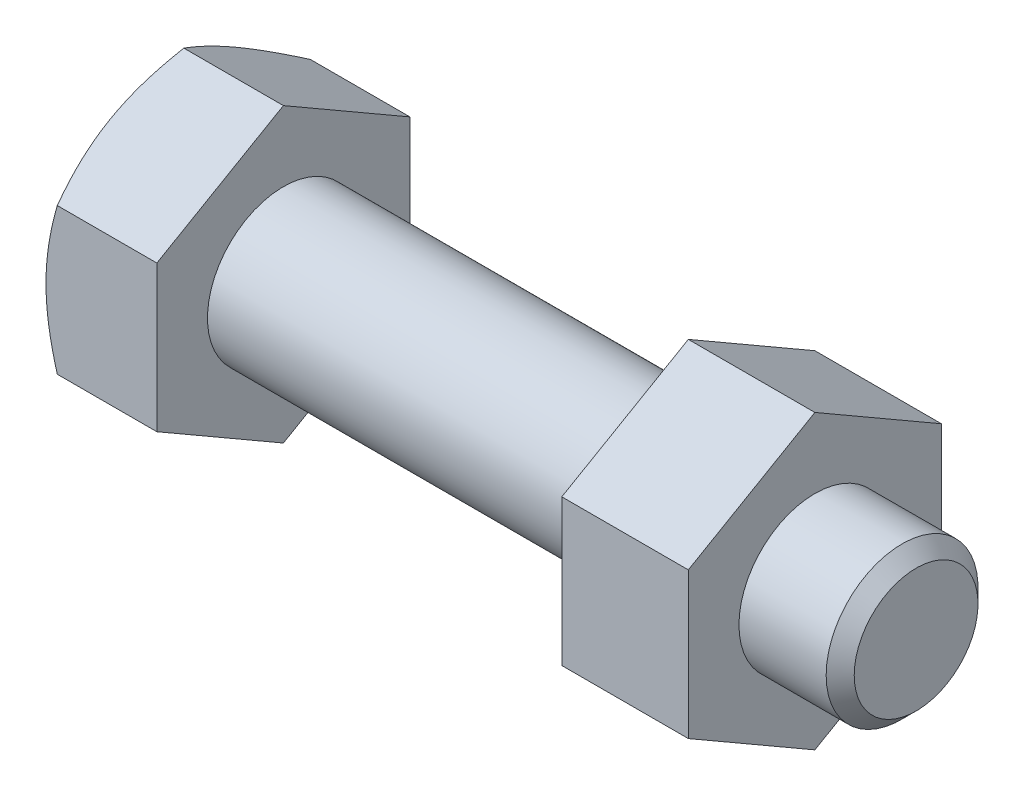
ISO-10303-21;
HEADER;
FILE_DESCRIPTION(('STEP AP214'),'2;1');
FILE_NAME('part.step','',(''),(''),'','','');
FILE_SCHEMA(('AUTOMOTIVE_DESIGN { 1 0 10303 214 1 1 1 1 }'));
ENDSEC;
DATA;
#1=APPLICATION_CONTEXT('core data for automotive mechanical design processes');
#2=APPLICATION_PROTOCOL_DEFINITION('international standard','automotive_design',2000,#1);
#3=PRODUCT_CONTEXT('',#1,'mechanical');
#4=PRODUCT('Part','Part','',(#3));
#5=PRODUCT_RELATED_PRODUCT_CATEGORY('part','',(#4));
#6=PRODUCT_DEFINITION_FORMATION('','',#4);
#7=PRODUCT_DEFINITION_CONTEXT('part definition',#1,'design');
#8=PRODUCT_DEFINITION('design','',#6,#7);
#9=PRODUCT_DEFINITION_SHAPE('','',#8);
#10=(LENGTH_UNIT() NAMED_UNIT(*) SI_UNIT(.MILLI.,.METRE.));
#11=(NAMED_UNIT(*) PLANE_ANGLE_UNIT() SI_UNIT($,.RADIAN.));
#12=(NAMED_UNIT(*) SI_UNIT($,.STERADIAN.) SOLID_ANGLE_UNIT());
#13=UNCERTAINTY_MEASURE_WITH_UNIT(LENGTH_MEASURE(1.E-05),#10,'distance_accuracy_value','');
#14=(GEOMETRIC_REPRESENTATION_CONTEXT(3) GLOBAL_UNCERTAINTY_ASSIGNED_CONTEXT((#13)) GLOBAL_UNIT_ASSIGNED_CONTEXT((#10,
#11,#12)) REPRESENTATION_CONTEXT('',''));
#15=CARTESIAN_POINT('',(0.,0.,0.));
#16=DIRECTION('',(0.,0.,1.));
#17=DIRECTION('',(1.,0.,0.));
#18=AXIS2_PLACEMENT_3D('',#15,#16,#17);
#19=CARTESIAN_POINT('',(0.,0.,0.));
#20=DIRECTION('',(-1.00000000000003,0.,0.));
#21=DIRECTION('',(0.,0.,1.00000000000003));
#22=AXIS2_PLACEMENT_3D('',#19,#20,#21);
#23=CYLINDRICAL_SURFACE('',#22,3.);
#24=CARTESIAN_POINT('',(4.37999999999961,-1.55431223447522E-12,-2.38697950294409E-12));
#25=DIRECTION('',(1.00000000000003,0.,0.));
#26=DIRECTION('',(0.,0.,-1.00000000000003));
#27=AXIS2_PLACEMENT_3D('',#24,#25,#26);
#28=CIRCLE('',#27,3.);
#29=CARTESIAN_POINT('',(4.37999999999961,-1.53932422364278E-12,-3.00000000000248));
#30=VERTEX_POINT('',#29);
#31=EDGE_CURVE('E305',#30,#30,#28,.F.);
#32=ORIENTED_EDGE('',*,*,#31,.F.);
#33=EDGE_LOOP('',(#32));
#34=FACE_BOUND('',#33,.T.);
#35=CARTESIAN_POINT('',(20.3799999999984,-1.66533453693773E-12,-5.27355936696949E-12));
#36=DIRECTION('',(1.00000000000003,0.,0.));
#37=DIRECTION('',(0.,0.,-1.00000000000003));
#38=AXIS2_PLACEMENT_3D('',#35,#36,#37);
#39=CIRCLE('',#38,3.);
#40=CARTESIAN_POINT('',(20.3799999999984,-1.6503465261053E-12,-3.00000000000537));
#41=VERTEX_POINT('',#40);
#42=EDGE_CURVE('E11',#41,#41,#39,.T.);
#43=ORIENTED_EDGE('',*,*,#42,.F.);
#44=EDGE_LOOP('',(#43));
#45=FACE_BOUND('',#44,.T.);
#46=ADVANCED_FACE('F34',(#34,#45),#23,.T.);
#47=CARTESIAN_POINT('',(4.37999999999911,2.88675134594507,-5.00000000000056));
#48=DIRECTION('',(0.,-0.866025403784492,0.50000000000002));
#49=DIRECTION('',(0.,-0.500000000000027,-0.86602540378446));
#50=AXIS2_PLACEMENT_3D('',#47,#48,#49);
#51=PLANE('',#50);
#52=CARTESIAN_POINT('',(0.44664865605093,5.7736181619501,0.000200000000671885));
#53=CARTESIAN_POINT('',(0.37338656763655,5.64675433464942,-0.219534594524097));
#54=CARTESIAN_POINT('',(0.306751321916835,5.51880543790398,-0.441148584458488));
#55=CARTESIAN_POINT('',(0.190438991009322,5.26069210252062,-0.888213995452737));
#56=CARTESIAN_POINT('',(0.140803049914237,5.13052307794464,-1.11367335959032));
#57=CARTESIAN_POINT('',(0.0635510254171793,4.87177839004364,-1.56183230522364));
#58=CARTESIAN_POINT('',(0.0354203782820658,4.74324302208091,-1.78446209310459));
#59=CARTESIAN_POINT('',(0.0101949219521058,4.54998783159793,-2.11918990184745));
#60=CARTESIAN_POINT('',(0.00461345976780419,4.48552534904795,-2.23084219680601));
#61=CARTESIAN_POINT('',(-0.000797783249745784,4.35654081066565,-2.45424997067507));
#62=CARTESIAN_POINT('',(-0.000627741742447269,4.292018756735,-2.56600544629177));
#63=CARTESIAN_POINT('',(0.00775363179195132,4.11524635304898,-2.87218423085213));
#64=CARTESIAN_POINT('',(0.0218297718964076,4.003054577688,-3.06650608596853));
#65=CARTESIAN_POINT('',(0.0664652571080783,3.77941563226123,-3.45386010199868));
#66=CARTESIAN_POINT('',(0.0970398601464054,3.66796924828095,-3.64689090137237));
#67=CARTESIAN_POINT('',(0.173468493620326,3.44387972422849,-4.03502534247528));
#68=CARTESIAN_POINT('',(0.21964637887785,3.331264865984,-4.23007999864195));
#69=CARTESIAN_POINT('',(0.32445179449087,3.10771464157672,-4.61728034535857));
#70=CARTESIAN_POINT('',(0.38305470343607,2.99677641204574,-4.80943099540768));
#71=CARTESIAN_POINT('',(0.446648656050153,2.88663587589133,-5.00019999999934));
#72=B_SPLINE_CURVE_WITH_KNOTS('',3,(#52,#53,#54,#55,#56,#57,#58,#59,#60,#61,#62,#63,#64,#65,#66,
#67,#68,#69,#70,#71),.UNSPECIFIED.,.F.,.F.,(4,2,2,2,2,2,2,2,2,4),(0.,0.792555841364099,
1.5870166005352,2.36181537487563,2.74884076077659,3.13585419177682,3.80962362600014,
4.48401723901465,5.17336882349133,5.86136694793868),.UNSPECIFIED.);
#73=CARTESIAN_POINT('',(0.446581987382566,5.77350269189636,0.));
#74=VERTEX_POINT('',#73);
#75=CARTESIAN_POINT('',(-1.60982338570648E-12,4.33012701892077,-2.49999999999928));
#76=VERTEX_POINT('',#75);
#77=EDGE_CURVE('E50',#74,#76,#72,.T.);
#78=ORIENTED_EDGE('',*,*,#77,.F.);
#79=DIRECTION('',(-1.00000000000003,0.,0.));
#80=VECTOR('',#79,1.);
#81=CARTESIAN_POINT('',(4.37999999999933,5.77350269189281,1.72084568816899E-12));
#82=LINE('',#81,#80);
#83=CARTESIAN_POINT('',(4.37999999999933,5.77350269189281,1.72084568816899E-12));
#84=VERTEX_POINT('',#83);
#85=EDGE_CURVE('E341',#84,#74,#82,.T.);
#86=ORIENTED_EDGE('',*,*,#85,.F.);
#87=DIRECTION('',(0.,0.500000000000029,0.866025403784461));
#88=VECTOR('',#87,1.);
#89=CARTESIAN_POINT('',(4.37999999999911,2.88675134594507,-5.00000000000056));
#90=LINE('',#89,#88);
#91=CARTESIAN_POINT('',(4.37999999999911,2.88675134594507,-5.00000000000056));
#92=VERTEX_POINT('',#91);
#93=EDGE_CURVE('E309',#92,#84,#90,.T.);
#94=ORIENTED_EDGE('',*,*,#93,.F.);
#95=DIRECTION('',(-1.00000000000003,0.,0.));
#96=VECTOR('',#95,1.);
#97=CARTESIAN_POINT('',(4.37999999999911,2.88675134594507,-5.00000000000056));
#98=LINE('',#97,#96);
#99=CARTESIAN_POINT('',(0.446581987384342,2.8867513459454,-5.00000000000095));
#100=VERTEX_POINT('',#99);
#101=EDGE_CURVE('E326',#92,#100,#98,.T.);
#102=ORIENTED_EDGE('',*,*,#101,.T.);
#103=EDGE_CURVE('E256',#76,#100,#72,.T.);
#104=ORIENTED_EDGE('',*,*,#103,.F.);
#105=EDGE_LOOP('',(#78,#86,#94,#102,#104));
#106=FACE_BOUND('',#105,.T.);
#107=ADVANCED_FACE('F36',(#106),#51,.F.);
#108=CARTESIAN_POINT('',(4.37999999999933,5.77350269189281,1.72084568816899E-12));
#109=DIRECTION('',(0.,-0.866025403784489,-0.500000000000013));
#110=DIRECTION('',(0.,0.500000000000032,-0.866025403784483));
#111=AXIS2_PLACEMENT_3D('',#108,#109,#110);
#112=PLANE('',#111);
#113=CARTESIAN_POINT('',(0.446648656052262,2.88663587589133,5.00020000000501));
#114=CARTESIAN_POINT('',(0.373386567637881,3.01349970318991,4.78046540547877));
#115=CARTESIAN_POINT('',(0.306751321918157,3.1414485999345,4.55885141554368));
#116=CARTESIAN_POINT('',(0.190438991010482,3.39956193531737,4.11178600454862));
#117=CARTESIAN_POINT('',(0.140803049915252,3.52973095989372,3.88632664041093));
#118=CARTESIAN_POINT('',(0.0635510254177231,3.78847564779521,3.43816769477735));
#119=CARTESIAN_POINT('',(0.0354203782822814,3.91701101575806,3.21553790689626));
#120=CARTESIAN_POINT('',(0.0101949219526077,4.11026620624094,2.88081009815303));
#121=CARTESIAN_POINT('',(0.00461345976853075,4.17472868879082,2.76915780319434));
#122=CARTESIAN_POINT('',(-0.000797783249966767,4.3037132271736,2.5457500293254));
#123=CARTESIAN_POINT('',(-0.000627741743841576,4.36823528110481,2.43399455370895));
#124=CARTESIAN_POINT('',(0.00775363178951034,4.54500768479133,2.12781576914873));
#125=CARTESIAN_POINT('',(0.0218297718957019,4.65719946015147,1.9334939140318));
#126=CARTESIAN_POINT('',(0.0664652571085981,4.88083840557772,1.5461398980011));
#127=CARTESIAN_POINT('',(0.0970398601464163,4.99228478955831,1.35310909862739));
#128=CARTESIAN_POINT('',(0.173468493619885,5.21637431361115,0.96497465752422));
#129=CARTESIAN_POINT('',(0.219646378877484,5.32898917185567,0.769920001357292));
#130=CARTESIAN_POINT('',(0.324451794490797,5.55253939626311,0.382719654640347));
#131=CARTESIAN_POINT('',(0.383054703436212,5.6634776257942,0.190569004591162));
#132=CARTESIAN_POINT('',(0.446648656050375,5.77361816194899,-0.000200000000394329));
#133=B_SPLINE_CURVE_WITH_KNOTS('',3,(#113,#114,#115,#116,#117,#118,#119,#120,#121,#122,#123,
#124,#125,#126,#127,#128,#129,#130,#131,#132),.UNSPECIFIED.,.F.,.F.,(4,2,2,2,2,2,2,2,2,4),(0.,
0.792555841364667,1.58701660053671,2.36181537487773,2.74884076077891,3.1358541917793,
3.80962362600293,4.48401723901789,5.17336882349527,5.86136694794307),.UNSPECIFIED.);
#134=CARTESIAN_POINT('',(0.446581987385453,2.88675134594696,5.00000000000211));
#135=VERTEX_POINT('',#134);
#136=CARTESIAN_POINT('',(1.66533453693773E-13,4.33012701891966,2.49999999999878));
#137=VERTEX_POINT('',#136);
#138=EDGE_CURVE('E58',#135,#137,#133,.T.);
#139=ORIENTED_EDGE('',*,*,#138,.F.);
#140=DIRECTION('',(-1.00000000000003,0.,0.));
#141=VECTOR('',#140,1.);
#142=CARTESIAN_POINT('',(4.37999999999994,2.88675134594651,4.99999999999956));
#143=LINE('',#142,#141);
#144=CARTESIAN_POINT('',(4.37999999999994,2.88675134594651,4.99999999999956));
#145=VERTEX_POINT('',#144);
#146=EDGE_CURVE('E338',#145,#135,#143,.T.);
#147=ORIENTED_EDGE('',*,*,#146,.F.);
#148=DIRECTION('',(0.,-0.500000000000032,0.866025403784483));
#149=VECTOR('',#148,1.);
#150=CARTESIAN_POINT('',(4.37999999999933,5.77350269189281,1.72084568816899E-12));
#151=LINE('',#150,#149);
#152=EDGE_CURVE('E316',#84,#145,#151,.T.);
#153=ORIENTED_EDGE('',*,*,#152,.F.);
#154=ORIENTED_EDGE('',*,*,#85,.T.);
#155=EDGE_CURVE('E253',#137,#74,#133,.T.);
#156=ORIENTED_EDGE('',*,*,#155,.F.);
#157=EDGE_LOOP('',(#139,#147,#153,#154,#156));
#158=FACE_BOUND('',#157,.T.);
#159=ADVANCED_FACE('F272',(#158),#112,.F.);
#160=CARTESIAN_POINT('',(4.37999999999994,2.88675134594651,4.99999999999956));
#161=DIRECTION('',(0.,0.,-1.00000000000003));
#162=DIRECTION('',(-1.00000000000003,0.,0.));
#163=AXIS2_PLACEMENT_3D('',#160,#161,#162);
#164=PLANE('',#163);
#165=CARTESIAN_POINT('',(2.47533544689116,-7.82661640314453,4.99999999999934));
#166=CARTESIAN_POINT('',(2.36879683507817,-7.60758613025377,4.99999999999944));
#167=CARTESIAN_POINT('',(2.26325911833191,-7.38806071364821,4.99999999999949));
#168=CARTESIAN_POINT('',(2.05474707866149,-6.9477564953581,4.99999999999952));
#169=CARTESIAN_POINT('',(1.95177314617173,-6.72697750898076,4.99999999999951));
#170=CARTESIAN_POINT('',(1.74844778545418,-6.28280027125984,4.9999999999995));
#171=CARTESIAN_POINT('',(1.64811306491012,-6.05939434593088,4.99999999999951));
#172=CARTESIAN_POINT('',(1.45145486004447,-5.61083043833277,4.99999999999951));
#173=CARTESIAN_POINT('',(1.35513119080744,-5.38567253740156,4.99999999999952));
#174=CARTESIAN_POINT('',(1.16445037606076,-4.92576614780541,4.99999999999951));
#175=CARTESIAN_POINT('',(1.07026351406108,-4.69094667859817,4.99999999999949));
#176=CARTESIAN_POINT('',(0.888844387351772,-4.21858752735682,4.99999999999954));
#177=CARTESIAN_POINT('',(0.801612892641432,-3.98104754746631,4.9999999999996));
#178=CARTESIAN_POINT('',(0.636341071884123,-3.5032908640466,4.99999999999944));
#179=CARTESIAN_POINT('',(0.558282765150865,-3.26308044250772,4.99999999999921));
#180=CARTESIAN_POINT('',(0.413813856737797,-2.77921467819837,4.99999999999983));
#181=CARTESIAN_POINT('',(0.347399663630812,-2.53556042276337,5.00000000000069));
#182=CARTESIAN_POINT('',(0.22970745053379,-2.04600448312851,5.00000000000066));
#183=CARTESIAN_POINT('',(0.178346573442397,-1.80012308686508,4.99999999999979));
#184=CARTESIAN_POINT('',(0.0936230804941734,-1.30522837494675,4.99999999999927));
#185=CARTESIAN_POINT('',(0.060258578924713,-1.05621539022796,4.99999999999963));
#186=CARTESIAN_POINT('',(0.014622993380336,-0.559584253786321,4.99999999999944));
#187=CARTESIAN_POINT('',(0.00207498506575455,-0.311992192970914,4.99999999999892));
#188=CARTESIAN_POINT('',(-0.00159747165069723,0.183375584053506,5.00000000000016));
#189=CARTESIAN_POINT('',(0.00727849448010078,0.431151303723401,5.00000000000192));
#190=CARTESIAN_POINT('',(0.0397265053197419,0.849622860754893,5.00000000000131));
#191=CARTESIAN_POINT('',(0.0579847912611552,1.02075746543815,5.00000000000002));
#192=CARTESIAN_POINT('',(0.103624049995999,1.36181398757166,4.99999999999906));
#193=CARTESIAN_POINT('',(0.131006199082085,1.53173574576912,4.99999999999938));
#194=CARTESIAN_POINT('',(0.225403333815212,2.03942834541215,4.99999999999988));
#195=CARTESIAN_POINT('',(0.304653621102849,2.37495177168182,4.99999999999963));
#196=CARTESIAN_POINT('',(0.44261179216726,2.87686006019758,4.99999999999951));
#197=CARTESIAN_POINT('',(0.492453035926658,3.04583048582168,4.99999999999952));
#198=CARTESIAN_POINT('',(0.59744196947861,3.38213061038251,4.99999999999959));
#199=CARTESIAN_POINT('',(0.65258969877528,3.54946029709455,4.99999999999964));
#200=CARTESIAN_POINT('',(0.767295730004591,3.882531223414,4.99999999999947));
#201=CARTESIAN_POINT('',(0.826852713135722,4.04827292136952,4.99999999999924));
#202=CARTESIAN_POINT('',(0.949663499108493,4.37837269603738,4.99999999999988));
#203=CARTESIAN_POINT('',(1.01291722636563,4.54273080096043,5.00000000000077));
#204=CARTESIAN_POINT('',(1.1838408530689,4.97467594039276,5.00000000000139));
#205=CARTESIAN_POINT('',(1.29410564783309,5.24123504256223,5.00000000000006));
#206=CARTESIAN_POINT('',(1.52085041203757,5.77170603525976,4.99999999999908));
#207=CARTESIAN_POINT('',(1.63733099805199,6.03561766007569,4.99999999999944));
#208=CARTESIAN_POINT('',(1.87507624393182,6.56138078777991,4.9999999999997));
#209=CARTESIAN_POINT('',(1.99634255328065,6.82323154238997,4.99999999999961));
#210=CARTESIAN_POINT('',(2.24254703861519,7.34518395601709,4.99999999999954));
#211=CARTESIAN_POINT('',(2.36748508200435,7.60528567778078,4.99999999999957));
#212=CARTESIAN_POINT('',(2.6204410288774,8.12446478659647,4.99999999999959));
#213=CARTESIAN_POINT('',(2.74846325061971,8.38354006552168,4.99999999999959));
#214=CARTESIAN_POINT('',(3.00682668967401,8.90053291127295,4.99999999999958));
#215=CARTESIAN_POINT('',(3.13716793074288,9.15845046620493,4.99999999999959));
#216=CARTESIAN_POINT('',(3.53092424591186,9.93067662274773,4.99999999999959));
#217=CARTESIAN_POINT('',(3.79712405172154,10.4435647238014,4.99999999999959));
#218=CARTESIAN_POINT('',(4.30724046881064,11.4147548711517,4.99999999999961));
#219=CARTESIAN_POINT('',(4.55067498762144,11.8733113483047,4.99999999999962));
#220=CARTESIAN_POINT('',(5.04052915785213,12.7888590468272,4.9999999999996));
#221=CARTESIAN_POINT('',(5.28694897482668,13.2458501795686,4.99999999999956));
#222=CARTESIAN_POINT('',(5.78122505346369,14.1571829390167,4.99999999999968));
#223=CARTESIAN_POINT('',(6.02907430461168,14.6115283739732,4.99999999999983));
#224=CARTESIAN_POINT('',(6.52648185519826,15.5192398746586,4.99999999999942));
#225=CARTESIAN_POINT('',(6.77604002809939,15.9726060096988,4.99999999999885));
#226=CARTESIAN_POINT('',(7.02622264559277,16.4256251044147,4.99999999999745));
#227=B_SPLINE_CURVE_WITH_KNOTS('',3,(#165,#166,#167,#168,#169,#170,#171,#172,#173,#174,#175,
#176,#177,#178,#179,#180,#181,#182,#183,#184,#185,#186,#187,#188,#189,#190,#191,#192,#193,#194,
#195,#196,#197,#198,#199,#200,#201,#202,#203,#204,#205,#206,#207,#208,#209,#210,#211,#212,#213,
#214,#215,#216,#217,#218,#219,#220,#221,#222,#223,#224,#225,#226),.UNSPECIFIED.,.F.,.F.,(4,2,2,
2,2,2,2,2,2,2,2,2,2,2,2,2,2,2,2,2,2,2,2,2,2,2,2,2,2,2,4),(0.,0.730708682143115,1.4615279703376,
2.19620403652969,2.93084619547867,3.68977491658302,4.44878753915886,5.20628666210961,
5.96355173484986,6.71656679485999,7.46950293642395,8.21233991237428,8.95519126159896,
9.47125991232571,9.98739512288426,11.0201893937448,11.5486465414701,12.0771076235977,
12.6054112774225,13.1337041332033,13.9989833719719,14.8643486020626,15.7300147459355,
16.5956496665105,17.4625765068288,18.3295122333813,20.0630293163848,21.6205191219213,
23.1780956996671,24.7307447704865,26.2832800921405),.UNSPECIFIED.);
#228=CARTESIAN_POINT('',(0.446581987386563,-2.88675134595118,5.00000000000039));
#229=VERTEX_POINT('',#228);
#230=CARTESIAN_POINT('',(-1.33226762955019E-12,-1.66533453693773E-12,4.99999999999984));
#231=VERTEX_POINT('',#230);
#232=EDGE_CURVE('E312',#229,#231,#227,.T.);
#233=ORIENTED_EDGE('',*,*,#232,.F.);
#234=DIRECTION('',(-1.00000000000003,0.,0.));
#235=VECTOR('',#234,1.);
#236=CARTESIAN_POINT('',(4.37999999999983,-2.88675134595107,5.00000000000234));
#237=LINE('',#236,#235);
#238=CARTESIAN_POINT('',(4.37999999999983,-2.88675134595107,5.00000000000234));
#239=VERTEX_POINT('',#238);
#240=EDGE_CURVE('E335',#239,#229,#237,.T.);
#241=ORIENTED_EDGE('',*,*,#240,.F.);
#242=DIRECTION('',(0.,-1.00000000000006,0.));
#243=VECTOR('',#242,1.);
#244=CARTESIAN_POINT('',(4.37999999999994,2.88675134594651,4.99999999999956));
#245=LINE('',#244,#243);
#246=EDGE_CURVE('E318',#145,#239,#245,.T.);
#247=ORIENTED_EDGE('',*,*,#246,.F.);
#248=ORIENTED_EDGE('',*,*,#146,.T.);
#249=EDGE_CURVE('E266',#231,#135,#227,.T.);
#250=ORIENTED_EDGE('',*,*,#249,.F.);
#251=EDGE_LOOP('',(#233,#241,#247,#248,#250));
#252=FACE_BOUND('',#251,.T.);
#253=ADVANCED_FACE('F243',(#252),#164,.F.);
#254=CARTESIAN_POINT('',(4.37999999999883,-5.77350269190113,-8.32667268468867E-13));
#255=DIRECTION('',(0.,0.866025403784493,-0.50000000000002));
#256=DIRECTION('',(0.,0.500000000000027,0.86602540378446));
#257=AXIS2_PLACEMENT_3D('',#254,#255,#256);
#258=PLANE('',#257);
#259=CARTESIAN_POINT('',(0.446648656050874,-5.77361816195132,-0.000200000002448242));
#260=CARTESIAN_POINT('',(0.373386567638809,-5.64675433465405,0.219534594524242));
#261=CARTESIAN_POINT('',(0.306751321920315,-5.51880543791017,0.441148584459069));
#262=CARTESIAN_POINT('',(0.19043899101388,-5.26069210252821,0.888213995453161));
#263=CARTESIAN_POINT('',(0.14080304991867,-5.13052307795206,1.11367335959015));
#264=CARTESIAN_POINT('',(0.0635510254210347,-4.87177839005128,1.56183230522261));
#265=CARTESIAN_POINT('',(0.0354203782854699,-4.74324302208893,1.78446209310327));
#266=CARTESIAN_POINT('',(0.0101949219563532,-4.54998783160622,2.11918990184544));
#267=CARTESIAN_POINT('',(0.00461345977258483,-4.48552534905631,2.2308421968037));
#268=CARTESIAN_POINT('',(-0.000797783247016293,-4.35654081067455,2.45424997067237));
#269=CARTESIAN_POINT('',(-0.000627741742304739,-4.29201875674438,2.56600544628897));
#270=CARTESIAN_POINT('',(0.0077536317897459,-4.11524635305869,2.87218423084939));
#271=CARTESIAN_POINT('',(0.021829771898008,-4.00305457769714,3.06650608596561));
#272=CARTESIAN_POINT('',(0.0664652571122535,-3.77941563226966,3.45386010199604));
#273=CARTESIAN_POINT('',(0.0970398601493531,-3.66796924828926,3.64689090137019));
#274=CARTESIAN_POINT('',(0.173468493622384,-3.44387972423654,4.03502534247402));
#275=CARTESIAN_POINT('',(0.219646378880286,-3.33126486599195,4.23007999864114));
#276=CARTESIAN_POINT('',(0.324451794493078,-3.10771464158378,4.6172803453583));
#277=CARTESIAN_POINT('',(0.383054703437662,-2.99677641205201,4.80943099540752));
#278=CARTESIAN_POINT('',(0.446648656049375,-2.88663587589599,5.00019999999918));
#279=B_SPLINE_CURVE_WITH_KNOTS('',3,(#259,#260,#261,#262,#263,#264,#265,#266,#267,#268,#269,
#270,#271,#272,#273,#274,#275,#276,#277,#278),.UNSPECIFIED.,.F.,.F.,(4,2,2,2,2,2,2,2,2,4),(0.,
0.792555841362092,1.58701660053212,2.36181537487122,2.74884076077133,3.13585419177054,
3.80962362599469,4.48401723901038,5.17336882348851,5.86136694793664),.UNSPECIFIED.);
#280=CARTESIAN_POINT('',(0.446581987383232,-5.77350269189703,1.11022302462516E-13));
#281=VERTEX_POINT('',#280);
#282=CARTESIAN_POINT('',(-5.55111512312578E-13,-4.33012701892566,2.49999999999945));
#283=VERTEX_POINT('',#282);
#284=EDGE_CURVE('E247',#281,#283,#279,.T.);
#285=ORIENTED_EDGE('',*,*,#284,.F.);
#286=DIRECTION('',(-1.00000000000003,0.,0.));
#287=VECTOR('',#286,1.);
#288=CARTESIAN_POINT('',(4.37999999999883,-5.77350269190113,-8.32667268468867E-13));
#289=LINE('',#288,#287);
#290=CARTESIAN_POINT('',(4.37999999999883,-5.77350269190113,-8.32667268468867E-13));
#291=VERTEX_POINT('',#290);
#292=EDGE_CURVE('E332',#291,#281,#289,.T.);
#293=ORIENTED_EDGE('',*,*,#292,.F.);
#294=DIRECTION('',(0.,-0.500000000000029,-0.866025403784461));
#295=VECTOR('',#294,1.);
#296=CARTESIAN_POINT('',(4.37999999999883,-5.77350269190113,-8.32667268468867E-13));
#297=LINE('',#296,#295);
#298=EDGE_CURVE('E320',#239,#291,#297,.T.);
#299=ORIENTED_EDGE('',*,*,#298,.F.);
#300=ORIENTED_EDGE('',*,*,#240,.T.);
#301=EDGE_CURVE('E255',#283,#229,#279,.T.);
#302=ORIENTED_EDGE('',*,*,#301,.F.);
#303=EDGE_LOOP('',(#285,#293,#299,#300,#302));
#304=FACE_BOUND('',#303,.T.);
#305=ADVANCED_FACE('F238',(#304),#258,.F.);
#306=CARTESIAN_POINT('',(4.38000000000038,-2.8867513459514,-5.00000000000195));
#307=DIRECTION('',(0.,0.866025403784489,0.500000000000015));
#308=DIRECTION('',(0.,-0.500000000000031,0.866025403784481));
#309=AXIS2_PLACEMENT_3D('',#306,#307,#308);
#310=PLANE('',#309);
#311=CARTESIAN_POINT('',(0.446648656050708,-2.88663587589622,-5.00020000000179));
#312=CARTESIAN_POINT('',(0.373386567638431,-3.01349970319637,-4.78046540547668));
#313=CARTESIAN_POINT('',(0.306751321919788,-3.1414485999415,-4.55885141554245));
#314=CARTESIAN_POINT('',(0.190438991013258,-3.39956193532445,-4.11178600454874));
#315=CARTESIAN_POINT('',(0.140803049918095,-3.52973095990032,-3.88632664041154));
#316=CARTESIAN_POINT('',(0.0635510254207509,-3.78847564780087,-3.43816769477879));
#317=CARTESIAN_POINT('',(0.035420378285431,-3.91701101576325,-3.21553790689803));
#318=CARTESIAN_POINT('',(0.0101949219560194,-4.11026620624628,-2.88081009815586));
#319=CARTESIAN_POINT('',(0.0046134597720428,-4.17472868879635,-2.7691578031976));
#320=CARTESIAN_POINT('',(-0.000797783246708283,-4.30371322717779,-2.54575002932857));
#321=CARTESIAN_POINT('',(-0.000627741740937427,-4.36823528110748,-2.43399455371159));
#322=CARTESIAN_POINT('',(0.00775363179207735,-4.54500768479279,-2.12781576915088));
#323=CARTESIAN_POINT('',(0.0218297718987949,-4.65719946015519,-1.93349391403514));
#324=CARTESIAN_POINT('',(0.0664652571119968,-4.88083840558319,-1.54613989800513));
#325=CARTESIAN_POINT('',(0.0970398601495963,-4.99228478956326,-1.35310909863091));
#326=CARTESIAN_POINT('',(0.173468493623031,-5.21637431361582,-0.964974657527298));
#327=CARTESIAN_POINT('',(0.21964637888082,-5.32898917186061,-0.769920001360442));
#328=CARTESIAN_POINT('',(0.324451794493623,-5.55253939626816,-0.382719654643209));
#329=CARTESIAN_POINT('',(0.383054703438335,-5.66347762579911,-0.190569004593664));
#330=CARTESIAN_POINT('',(0.446648656050708,-5.77361816195299,0.00019999999900655));
#331=B_SPLINE_CURVE_WITH_KNOTS('',3,(#311,#312,#313,#314,#315,#316,#317,#318,#319,#320,#321,
#322,#323,#324,#325,#326,#327,#328,#329,#330),.UNSPECIFIED.,.F.,.F.,(4,2,2,2,2,2,2,2,2,4),(0.,
0.792555841362505,1.5870166005326,2.36181537487197,2.74884076077229,3.13585419177177,
3.80962362599578,4.48401723901121,5.17336882348891,5.86136694793686),.UNSPECIFIED.);
#332=CARTESIAN_POINT('',(0.446581987386674,-2.88675134595062,-5.00000000000245));
#333=VERTEX_POINT('',#332);
#334=CARTESIAN_POINT('',(-6.66133814775094E-13,-4.33012701892521,-2.50000000000372));
#335=VERTEX_POINT('',#334);
#336=EDGE_CURVE('E215',#333,#335,#331,.T.);
#337=ORIENTED_EDGE('',*,*,#336,.F.);
#338=DIRECTION('',(-1.00000000000003,0.,0.));
#339=VECTOR('',#338,1.);
#340=CARTESIAN_POINT('',(4.38000000000038,-2.8867513459514,-5.00000000000195));
#341=LINE('',#340,#339);
#342=CARTESIAN_POINT('',(4.38000000000038,-2.8867513459514,-5.00000000000195));
#343=VERTEX_POINT('',#342);
#344=EDGE_CURVE('E329',#343,#333,#341,.T.);
#345=ORIENTED_EDGE('',*,*,#344,.F.);
#346=DIRECTION('',(0.,0.500000000000031,-0.866025403784481));
#347=VECTOR('',#346,1.);
#348=CARTESIAN_POINT('',(4.38000000000038,-2.8867513459514,-5.00000000000195));
#349=LINE('',#348,#347);
#350=EDGE_CURVE('E322',#291,#343,#349,.T.);
#351=ORIENTED_EDGE('',*,*,#350,.F.);
#352=ORIENTED_EDGE('',*,*,#292,.T.);
#353=EDGE_CURVE('E254',#335,#281,#331,.T.);
#354=ORIENTED_EDGE('',*,*,#353,.F.);
#355=EDGE_LOOP('',(#337,#345,#351,#352,#354));
#356=FACE_BOUND('',#355,.T.);
#357=ADVANCED_FACE('F231',(#356),#310,.F.);
#358=CARTESIAN_POINT('',(4.37999999999911,2.88675134594507,-5.00000000000056));
#359=DIRECTION('',(0.,0.,1.00000000000003));
#360=DIRECTION('',(1.00000000000003,0.,0.));
#361=AXIS2_PLACEMENT_3D('',#358,#359,#360);
#362=PLANE('',#361);
#363=CARTESIAN_POINT('',(2.47533544689282,-7.82661640314386,-5.0000000000005));
#364=CARTESIAN_POINT('',(2.36879683507894,-7.60758613025342,-5.00000000000058));
#365=CARTESIAN_POINT('',(2.26325911833228,-7.38806071364794,-5.0000000000006));
#366=CARTESIAN_POINT('',(2.05474707866154,-6.94775649535778,-5.00000000000063));
#367=CARTESIAN_POINT('',(1.95177314617184,-6.7269775089803,-5.00000000000062));
#368=CARTESIAN_POINT('',(1.74844778545432,-6.28280027125921,-5.00000000000061));
#369=CARTESIAN_POINT('',(1.64811306491023,-6.05939434593022,-5.00000000000061));
#370=CARTESIAN_POINT('',(1.45145486004456,-5.61083043833203,-5.00000000000061));
#371=CARTESIAN_POINT('',(1.35513119080753,-5.38567253740076,-5.00000000000062));
#372=CARTESIAN_POINT('',(1.16445037606085,-4.92576614780454,-5.00000000000059));
#373=CARTESIAN_POINT('',(1.07026351406116,-4.69094667859728,-5.00000000000055));
#374=CARTESIAN_POINT('',(0.888844387351914,-4.21858752735589,-5.00000000000066));
#375=CARTESIAN_POINT('',(0.801612892641645,-3.98104754746536,-5.0000000000008));
#376=CARTESIAN_POINT('',(0.636341071884224,-3.50329086404563,-5.0000000000004));
#377=CARTESIAN_POINT('',(0.558282765150785,-3.26308044250675,-4.99999999999985));
#378=CARTESIAN_POINT('',(0.413813856738271,-2.77921467819715,-5.00000000000135));
#379=CARTESIAN_POINT('',(0.347399663632023,-2.5355604227619,-5.0000000000034));
#380=CARTESIAN_POINT('',(0.229707450535047,-2.04600448312698,-5.00000000000338));
#381=CARTESIAN_POINT('',(0.178346573442964,-1.80012308686375,-5.00000000000132));
#382=CARTESIAN_POINT('',(0.0936230804943419,-1.30522837494564,-4.99999999999986));
#383=CARTESIAN_POINT('',(0.0602585789251704,-1.05621539022687,-5.00000000000045));
#384=CARTESIAN_POINT('',(0.014622993380871,-0.559584253785312,-5.00000000000073));
#385=CARTESIAN_POINT('',(0.00207498506608664,-0.311992192969957,-5.00000000000043));
#386=CARTESIAN_POINT('',(-0.00159747164984993,0.183375584054349,-5.00000000000074));
#387=CARTESIAN_POINT('',(0.00727849448166841,0.43115130372418,-5.00000000000133));
#388=CARTESIAN_POINT('',(0.0397265053211058,0.84962286075576,-5.00000000000115));
#389=CARTESIAN_POINT('',(0.0579847912620373,1.02075746543914,-5.00000000000074));
#390=CARTESIAN_POINT('',(0.103624049996548,1.3618139875728,-5.00000000000042));
#391=CARTESIAN_POINT('',(0.131006199082782,1.53173574577031,-5.00000000000052));
#392=CARTESIAN_POINT('',(0.225403333816168,2.03942834541346,-5.00000000000069));
#393=CARTESIAN_POINT('',(0.304653621103732,2.37495177168324,-5.00000000000063));
#394=CARTESIAN_POINT('',(0.442611792168197,2.87686006019911,-5.00000000000054));
#395=CARTESIAN_POINT('',(0.49245303592764,3.04583048582323,-5.00000000000051));
#396=CARTESIAN_POINT('',(0.597441969479585,3.38213061038414,-5.00000000000062));
#397=CARTESIAN_POINT('',(0.652589698776205,3.54946029709623,-5.00000000000076));
#398=CARTESIAN_POINT('',(0.767295730005735,3.88253122341567,-5.00000000000037));
#399=CARTESIAN_POINT('',(0.826852713137137,4.04827292137113,-4.99999999999984));
#400=CARTESIAN_POINT('',(0.94966349910926,4.37837269603931,-5.00000000000128));
#401=CARTESIAN_POINT('',(1.01291722636548,4.54273080096276,-5.00000000000325));
#402=CARTESIAN_POINT('',(1.18384085306806,4.97467594039524,-5.00000000000465));
#403=CARTESIAN_POINT('',(1.29410564783362,5.24123504256404,-5.00000000000165));
#404=CARTESIAN_POINT('',(1.52085041203906,5.77170603526096,-4.99999999999946));
#405=CARTESIAN_POINT('',(1.63733099805307,6.03561766007695,-5.00000000000026));
#406=CARTESIAN_POINT('',(1.87507624393255,6.56138078778114,-5.00000000000084));
#407=CARTESIAN_POINT('',(1.99634255328145,6.8232315423911,-5.00000000000062));
#408=CARTESIAN_POINT('',(2.242547038616,7.34518395601804,-5.00000000000046));
#409=CARTESIAN_POINT('',(2.36748508200509,7.60528567778167,-5.00000000000052));
#410=CARTESIAN_POINT('',(2.62044102887805,8.12446478659723,-5.00000000000056));
#411=CARTESIAN_POINT('',(2.74846325062033,8.38354006552238,-5.00000000000054));
#412=CARTESIAN_POINT('',(3.00682668967457,8.90053291127353,-5.00000000000053));
#413=CARTESIAN_POINT('',(3.1371679307434,9.15845046620545,-5.00000000000053));
#414=CARTESIAN_POINT('',(3.53092424591226,9.93067662274806,-5.00000000000053));
#415=CARTESIAN_POINT('',(3.79712405172185,10.4435647238015,-5.00000000000053));
#416=CARTESIAN_POINT('',(4.3072404688109,11.4147548711518,-5.00000000000051));
#417=CARTESIAN_POINT('',(4.55067498762172,11.8733113483048,-5.0000000000005));
#418=CARTESIAN_POINT('',(5.04052915785245,12.7888590468275,-5.00000000000053));
#419=CARTESIAN_POINT('',(5.28694897482701,13.245850179569,-5.00000000000057));
#420=CARTESIAN_POINT('',(5.78122505346408,14.1571829390171,-5.00000000000044));
#421=CARTESIAN_POINT('',(6.02907430461213,14.6115283739736,-5.00000000000027));
#422=CARTESIAN_POINT('',(6.52648185519863,15.5192398746591,-5.00000000000072));
#423=CARTESIAN_POINT('',(6.77604002809964,15.9726060096995,-5.00000000000135));
#424=CARTESIAN_POINT('',(7.02622264559272,16.4256251044155,-5.00000000000289));
#425=B_SPLINE_CURVE_WITH_KNOTS('',3,(#363,#364,#365,#366,#367,#368,#369,#370,#371,#372,#373,
#374,#375,#376,#377,#378,#379,#380,#381,#382,#383,#384,#385,#386,#387,#388,#389,#390,#391,#392,
#393,#394,#395,#396,#397,#398,#399,#400,#401,#402,#403,#404,#405,#406,#407,#408,#409,#410,#411,
#412,#413,#414,#415,#416,#417,#418,#419,#420,#421,#422,#423,#424),.UNSPECIFIED.,.F.,.F.,(4,2,2,
2,2,2,2,2,2,2,2,2,2,2,2,2,2,2,2,2,2,2,2,2,2,2,2,2,2,2,4),(0.,0.73070868214342,1.46152797033818,
2.19620403653039,2.93084619547952,3.68977491658393,4.44878753915978,5.20628666211065,
5.96355173485108,6.71656679486108,7.46950293642482,8.212339912375,8.9551912615996,
9.47125991232657,9.98739512288528,11.0201893937461,11.5486465414715,12.0771076235992,
12.6054112774242,13.133704133205,13.9989833719732,14.8643486020637,15.7300147459364,
16.5956496665111,17.4625765068293,18.3295122333815,20.0630293163846,21.6205191219212,
23.1780956996672,24.7307447704866,26.2832800921408),.UNSPECIFIED.);
#426=CARTESIAN_POINT('',(-1.22124532708767E-12,-2.44249065417534E-12,-5.00000000000256));
#427=VERTEX_POINT('',#426);
#428=EDGE_CURVE('E214',#100,#427,#425,.F.);
#429=ORIENTED_EDGE('',*,*,#428,.F.);
#430=ORIENTED_EDGE('',*,*,#101,.F.);
#431=DIRECTION('',(0.,1.00000000000006,0.));
#432=VECTOR('',#431,1.);
#433=CARTESIAN_POINT('',(4.37999999999911,2.88675134594507,-5.00000000000056));
#434=LINE('',#433,#432);
#435=EDGE_CURVE('E324',#343,#92,#434,.T.);
#436=ORIENTED_EDGE('',*,*,#435,.F.);
#437=ORIENTED_EDGE('',*,*,#344,.T.);
#438=EDGE_CURVE('E206',#427,#333,#425,.F.);
#439=ORIENTED_EDGE('',*,*,#438,.F.);
#440=EDGE_LOOP('',(#429,#430,#436,#437,#439));
#441=FACE_BOUND('',#440,.T.);
#442=ADVANCED_FACE('F226',(#441),#362,.F.);
#443=CARTESIAN_POINT('',(4.37999999999827,-3.33066907387547E-12,-10.0000000000008));
#444=DIRECTION('',(1.00000000000003,0.,0.));
#445=DIRECTION('',(0.,0.,-1.00000000000003));
#446=AXIS2_PLACEMENT_3D('',#443,#444,#445);
#447=PLANE('',#446);
#448=ORIENTED_EDGE('',*,*,#31,.T.);
#449=EDGE_LOOP('',(#448));
#450=FACE_BOUND('',#449,.T.);
#451=ORIENTED_EDGE('',*,*,#93,.T.);
#452=ORIENTED_EDGE('',*,*,#152,.T.);
#453=ORIENTED_EDGE('',*,*,#246,.T.);
#454=ORIENTED_EDGE('',*,*,#298,.T.);
#455=ORIENTED_EDGE('',*,*,#350,.T.);
#456=ORIENTED_EDGE('',*,*,#435,.T.);
#457=EDGE_LOOP('',(#451,#452,#453,#454,#455,#456));
#458=FACE_BOUND('',#457,.T.);
#459=ADVANCED_FACE('F230',(#450,#458),#447,.T.);
#460=CARTESIAN_POINT('',(0.,0.,0.));
#461=DIRECTION('',(1.00000000000003,0.,0.));
#462=DIRECTION('',(0.,0.,-1.00000000000003));
#463=AXIS2_PLACEMENT_3D('',#460,#461,#462);
#464=CONICAL_SURFACE('',#463,5.,1.0471975511966);
#465=ORIENTED_EDGE('',*,*,#336,.T.);
#466=CARTESIAN_POINT('',(0.,0.,0.));
#467=DIRECTION('',(1.00000000000003,0.,0.));
#468=DIRECTION('',(0.,0.,-1.00000000000003));
#469=AXIS2_PLACEMENT_3D('',#466,#467,#468);
#470=CIRCLE('',#469,5.);
#471=EDGE_CURVE('E344',#335,#427,#470,.T.);
#472=ORIENTED_EDGE('',*,*,#471,.T.);
#473=ORIENTED_EDGE('',*,*,#438,.T.);
#474=EDGE_LOOP('',(#465,#472,#473));
#475=FACE_BOUND('',#474,.T.);
#476=ADVANCED_FACE('F384',(#475),#464,.T.);
#477=ORIENTED_EDGE('',*,*,#284,.T.);
#478=EDGE_CURVE('E346',#283,#335,#470,.T.);
#479=ORIENTED_EDGE('',*,*,#478,.T.);
#480=ORIENTED_EDGE('',*,*,#353,.T.);
#481=EDGE_LOOP('',(#477,#479,#480));
#482=FACE_BOUND('',#481,.T.);
#483=ADVANCED_FACE('F386',(#482),#464,.T.);
#484=ORIENTED_EDGE('',*,*,#232,.T.);
#485=EDGE_CURVE('E351',#231,#283,#470,.T.);
#486=ORIENTED_EDGE('',*,*,#485,.T.);
#487=ORIENTED_EDGE('',*,*,#301,.T.);
#488=EDGE_LOOP('',(#484,#486,#487));
#489=FACE_BOUND('',#488,.T.);
#490=ADVANCED_FACE('F222',(#489),#464,.T.);
#491=ORIENTED_EDGE('',*,*,#249,.T.);
#492=ORIENTED_EDGE('',*,*,#138,.T.);
#493=CARTESIAN_POINT('',(0.,0.,0.));
#494=DIRECTION('',(-1.00000000000003,0.,0.));
#495=DIRECTION('',(0.,0.,1.00000000000003));
#496=AXIS2_PLACEMENT_3D('',#493,#494,#495);
#497=CIRCLE('',#496,5.);
#498=EDGE_CURVE('E203',#231,#137,#497,.T.);
#499=ORIENTED_EDGE('',*,*,#498,.F.);
#500=EDGE_LOOP('',(#491,#492,#499));
#501=FACE_BOUND('',#500,.T.);
#502=ADVANCED_FACE('F369',(#501),#464,.T.);
#503=ORIENTED_EDGE('',*,*,#155,.T.);
#504=ORIENTED_EDGE('',*,*,#77,.T.);
#505=EDGE_CURVE('E352',#76,#137,#470,.T.);
#506=ORIENTED_EDGE('',*,*,#505,.T.);
#507=EDGE_LOOP('',(#503,#504,#506));
#508=FACE_BOUND('',#507,.T.);
#509=ADVANCED_FACE('F388',(#508),#464,.T.);
#510=ORIENTED_EDGE('',*,*,#103,.T.);
#511=ORIENTED_EDGE('',*,*,#428,.T.);
#512=EDGE_CURVE('E43',#427,#76,#470,.T.);
#513=ORIENTED_EDGE('',*,*,#512,.T.);
#514=EDGE_LOOP('',(#510,#511,#513));
#515=FACE_BOUND('',#514,.T.);
#516=ADVANCED_FACE('F380',(#515),#464,.T.);
#517=CARTESIAN_POINT('',(-1.88737914186277E-12,5.55111512312578E-13,-10.0000000000016));
#518=DIRECTION('',(1.00000000000003,0.,0.));
#519=DIRECTION('',(0.,0.,-1.00000000000003));
#520=AXIS2_PLACEMENT_3D('',#517,#518,#519);
#521=PLANE('',#520);
#522=ORIENTED_EDGE('',*,*,#512,.F.);
#523=ORIENTED_EDGE('',*,*,#471,.F.);
#524=ORIENTED_EDGE('',*,*,#478,.F.);
#525=ORIENTED_EDGE('',*,*,#485,.F.);
#526=ORIENTED_EDGE('',*,*,#498,.T.);
#527=ORIENTED_EDGE('',*,*,#505,.F.);
#528=EDGE_LOOP('',(#522,#523,#524,#525,#526,#527));
#529=FACE_BOUND('',#528,.T.);
#530=ADVANCED_FACE('F233',(#529),#521,.F.);
#531=CARTESIAN_POINT('',(20.38,2.8867513459474,-5.00000000000395));
#532=DIRECTION('',(0.,0.866025403784491,-0.500000000000017));
#533=DIRECTION('',(0.,0.500000000000027,0.86602540378446));
#534=AXIS2_PLACEMENT_3D('',#531,#532,#533);
#535=PLANE('',#534);
#536=DIRECTION('',(0.,0.500000000000027,0.866025403784459));
#537=VECTOR('',#536,1.);
#538=CARTESIAN_POINT('',(25.3800000000004,2.8867513459474,-5.00000000000367));
#539=LINE('',#538,#537);
#540=CARTESIAN_POINT('',(25.3800000000004,2.8867513459474,-5.00000000000367));
#541=VERTEX_POINT('',#540);
#542=CARTESIAN_POINT('',(25.3799999999993,5.77350269189469,-4.44089209850063E-12));
#543=VERTEX_POINT('',#542);
#544=EDGE_CURVE('E183',#541,#543,#539,.T.);
#545=ORIENTED_EDGE('',*,*,#544,.F.);
#546=DIRECTION('',(1.00000000000003,0.,0.));
#547=VECTOR('',#546,1.);
#548=CARTESIAN_POINT('',(20.38,2.8867513459474,-5.00000000000395));
#549=LINE('',#548,#547);
#550=CARTESIAN_POINT('',(20.38,2.8867513459474,-5.00000000000395));
#551=VERTEX_POINT('',#550);
#552=EDGE_CURVE('E168',#551,#541,#549,.T.);
#553=ORIENTED_EDGE('',*,*,#552,.F.);
#554=DIRECTION('',(0.,0.500000000000027,0.866025403784459));
#555=VECTOR('',#554,1.);
#556=CARTESIAN_POINT('',(20.38,2.8867513459474,-5.00000000000395));
#557=LINE('',#556,#555);
#558=CARTESIAN_POINT('',(20.38,5.7735026918958,-2.88657986402541E-12));
#559=VERTEX_POINT('',#558);
#560=EDGE_CURVE('E161',#551,#559,#557,.T.);
#561=ORIENTED_EDGE('',*,*,#560,.T.);
#562=DIRECTION('',(1.00000000000003,0.,0.));
#563=VECTOR('',#562,1.);
#564=CARTESIAN_POINT('',(20.38,5.7735026918958,-2.88657986402541E-12));
#565=LINE('',#564,#563);
#566=EDGE_CURVE('E143',#559,#543,#565,.T.);
#567=ORIENTED_EDGE('',*,*,#566,.T.);
#568=EDGE_LOOP('',(#545,#553,#561,#567));
#569=FACE_BOUND('',#568,.T.);
#570=ADVANCED_FACE('F167',(#569),#535,.T.);
#571=CARTESIAN_POINT('',(20.3799999999986,-2.88675134595173,-5.00000000000483));
#572=DIRECTION('',(0.,0.,-1.00000000000003));
#573=DIRECTION('',(0.,1.00000000000006,0.));
#574=AXIS2_PLACEMENT_3D('',#571,#572,#573);
#575=PLANE('',#574);
#576=DIRECTION('',(0.,1.00000000000006,0.));
#577=VECTOR('',#576,1.);
#578=CARTESIAN_POINT('',(25.3800000000021,-2.8867513459504,-5.00000000000467));
#579=LINE('',#578,#577);
#580=CARTESIAN_POINT('',(25.3800000000021,-2.8867513459504,-5.00000000000467));
#581=VERTEX_POINT('',#580);
#582=EDGE_CURVE('E169',#581,#541,#579,.T.);
#583=ORIENTED_EDGE('',*,*,#582,.F.);
#584=DIRECTION('',(1.00000000000003,0.,0.));
#585=VECTOR('',#584,1.);
#586=CARTESIAN_POINT('',(20.3799999999986,-2.88675134595173,-5.00000000000483));
#587=LINE('',#586,#585);
#588=CARTESIAN_POINT('',(20.3799999999986,-2.88675134595173,-5.00000000000483));
#589=VERTEX_POINT('',#588);
#590=EDGE_CURVE('E196',#589,#581,#587,.T.);
#591=ORIENTED_EDGE('',*,*,#590,.F.);
#592=DIRECTION('',(0.,1.00000000000006,0.));
#593=VECTOR('',#592,1.);
#594=CARTESIAN_POINT('',(20.3799999999986,-2.88675134595173,-5.00000000000483));
#595=LINE('',#594,#593);
#596=EDGE_CURVE('E154',#589,#551,#595,.T.);
#597=ORIENTED_EDGE('',*,*,#596,.T.);
#598=ORIENTED_EDGE('',*,*,#552,.T.);
#599=EDGE_LOOP('',(#583,#591,#597,#598));
#600=FACE_BOUND('',#599,.T.);
#601=ADVANCED_FACE('F500',(#600),#575,.T.);
#602=CARTESIAN_POINT('',(20.3799999999996,-5.7735026918988,-4.21884749357559E-12));
#603=DIRECTION('',(0.,-0.866025403784484,-0.500000000000012));
#604=DIRECTION('',(0.,0.500000000000031,-0.866025403784483));
#605=AXIS2_PLACEMENT_3D('',#602,#603,#604);
#606=PLANE('',#605);
#607=DIRECTION('',(0.,0.50000000000003,-0.866025403784479));
#608=VECTOR('',#607,1.);
#609=CARTESIAN_POINT('',(25.3800000000013,-5.77350269189969,-1.99840144432528E-12));
#610=LINE('',#609,#608);
#611=CARTESIAN_POINT('',(25.3800000000013,-5.77350269189969,-1.99840144432528E-12));
#612=VERTEX_POINT('',#611);
#613=EDGE_CURVE('E172',#612,#581,#610,.T.);
#614=ORIENTED_EDGE('',*,*,#613,.F.);
#615=DIRECTION('',(1.00000000000003,0.,0.));
#616=VECTOR('',#615,1.);
#617=CARTESIAN_POINT('',(20.3799999999996,-5.7735026918988,-4.21884749357559E-12));
#618=LINE('',#617,#616);
#619=CARTESIAN_POINT('',(20.3799999999996,-5.7735026918988,-4.21884749357559E-12));
#620=VERTEX_POINT('',#619);
#621=EDGE_CURVE('E198',#620,#612,#618,.T.);
#622=ORIENTED_EDGE('',*,*,#621,.F.);
#623=DIRECTION('',(0.,0.50000000000003,-0.866025403784479));
#624=VECTOR('',#623,1.);
#625=CARTESIAN_POINT('',(20.3799999999996,-5.7735026918988,-4.21884749357559E-12));
#626=LINE('',#625,#624);
#627=EDGE_CURVE('E179',#620,#589,#626,.T.);
#628=ORIENTED_EDGE('',*,*,#627,.T.);
#629=ORIENTED_EDGE('',*,*,#590,.T.);
#630=EDGE_LOOP('',(#614,#622,#628,#629));
#631=FACE_BOUND('',#630,.T.);
#632=ADVANCED_FACE('F492',(#631),#606,.T.);
#633=CARTESIAN_POINT('',(20.3799999999968,-2.88675134595173,4.9999999999949));
#634=DIRECTION('',(0.,-0.866025403784491,0.500000000000017));
#635=DIRECTION('',(0.,-0.500000000000027,-0.866025403784459));
#636=AXIS2_PLACEMENT_3D('',#633,#634,#635);
#637=PLANE('',#636);
#638=DIRECTION('',(0.,-0.500000000000027,-0.866025403784459));
#639=VECTOR('',#638,1.);
#640=CARTESIAN_POINT('',(25.3799999999995,-2.88675134595018,4.99999999999817));
#641=LINE('',#640,#639);
#642=CARTESIAN_POINT('',(25.3799999999995,-2.88675134595018,4.99999999999817));
#643=VERTEX_POINT('',#642);
#644=EDGE_CURVE('E189',#643,#612,#641,.T.);
#645=ORIENTED_EDGE('',*,*,#644,.F.);
#646=DIRECTION('',(1.00000000000003,0.,0.));
#647=VECTOR('',#646,1.);
#648=CARTESIAN_POINT('',(20.3799999999968,-2.88675134595173,4.9999999999949));
#649=LINE('',#648,#647);
#650=CARTESIAN_POINT('',(20.3799999999968,-2.88675134595173,4.9999999999949));
#651=VERTEX_POINT('',#650);
#652=EDGE_CURVE('E200',#651,#643,#649,.T.);
#653=ORIENTED_EDGE('',*,*,#652,.F.);
#654=DIRECTION('',(0.,-0.500000000000027,-0.866025403784459));
#655=VECTOR('',#654,1.);
#656=CARTESIAN_POINT('',(20.3799999999968,-2.88675134595173,4.9999999999949));
#657=LINE('',#656,#655);
#658=EDGE_CURVE('E176',#651,#620,#657,.T.);
#659=ORIENTED_EDGE('',*,*,#658,.T.);
#660=ORIENTED_EDGE('',*,*,#621,.T.);
#661=EDGE_LOOP('',(#645,#653,#659,#660));
#662=FACE_BOUND('',#661,.T.);
#663=ADVANCED_FACE('F484',(#662),#637,.T.);
#664=CARTESIAN_POINT('',(20.3799999999985,2.88675134594563,4.99999999999579));
#665=DIRECTION('',(0.,0.,1.00000000000003));
#666=DIRECTION('',(0.,-1.00000000000006,0.));
#667=AXIS2_PLACEMENT_3D('',#664,#665,#666);
#668=PLANE('',#667);
#669=DIRECTION('',(0.,-1.00000000000006,0.));
#670=VECTOR('',#669,1.);
#671=CARTESIAN_POINT('',(25.3800000000016,2.88675134594707,4.99999999999823));
#672=LINE('',#671,#670);
#673=CARTESIAN_POINT('',(25.3800000000016,2.88675134594707,4.99999999999823));
#674=VERTEX_POINT('',#673);
#675=EDGE_CURVE('E186',#674,#643,#672,.T.);
#676=ORIENTED_EDGE('',*,*,#675,.F.);
#677=DIRECTION('',(1.00000000000003,0.,0.));
#678=VECTOR('',#677,1.);
#679=CARTESIAN_POINT('',(20.3799999999985,2.88675134594563,4.99999999999579));
#680=LINE('',#679,#678);
#681=CARTESIAN_POINT('',(20.3799999999985,2.88675134594563,4.99999999999579));
#682=VERTEX_POINT('',#681);
#683=EDGE_CURVE('E153',#682,#674,#680,.T.);
#684=ORIENTED_EDGE('',*,*,#683,.F.);
#685=DIRECTION('',(0.,-1.00000000000006,0.));
#686=VECTOR('',#685,1.);
#687=CARTESIAN_POINT('',(20.3799999999985,2.88675134594563,4.99999999999579));
#688=LINE('',#687,#686);
#689=EDGE_CURVE('E165',#682,#651,#688,.T.);
#690=ORIENTED_EDGE('',*,*,#689,.T.);
#691=ORIENTED_EDGE('',*,*,#652,.T.);
#692=EDGE_LOOP('',(#676,#684,#690,#691));
#693=FACE_BOUND('',#692,.T.);
#694=ADVANCED_FACE('F477',(#693),#668,.T.);
#695=CARTESIAN_POINT('',(20.38,5.7735026918958,-2.88657986402541E-12));
#696=DIRECTION('',(0.,0.86602540378449,0.500000000000013));
#697=DIRECTION('',(0.,-0.500000000000034,0.866025403784481));
#698=AXIS2_PLACEMENT_3D('',#695,#696,#697);
#699=PLANE('',#698);
#700=DIRECTION('',(0.,-0.500000000000034,0.866025403784481));
#701=VECTOR('',#700,1.);
#702=CARTESIAN_POINT('',(25.3799999999993,5.77350269189469,-4.44089209850063E-12));
#703=LINE('',#702,#701);
#704=EDGE_CURVE('E148',#543,#674,#703,.T.);
#705=ORIENTED_EDGE('',*,*,#704,.F.);
#706=ORIENTED_EDGE('',*,*,#566,.F.);
#707=DIRECTION('',(0.,-0.500000000000034,0.866025403784481));
#708=VECTOR('',#707,1.);
#709=CARTESIAN_POINT('',(20.38,5.7735026918958,-2.88657986402541E-12));
#710=LINE('',#709,#708);
#711=EDGE_CURVE('E146',#559,#682,#710,.T.);
#712=ORIENTED_EDGE('',*,*,#711,.T.);
#713=ORIENTED_EDGE('',*,*,#683,.T.);
#714=EDGE_LOOP('',(#705,#706,#712,#713));
#715=FACE_BOUND('',#714,.T.);
#716=ADVANCED_FACE('F145',(#715),#699,.T.);
#717=CARTESIAN_POINT('',(20.3799999999984,-1.66533453693773E-12,-5.27355936696949E-12));
#718=DIRECTION('',(1.00000000000003,0.,0.));
#719=DIRECTION('',(0.,0.,-1.00000000000003));
#720=AXIS2_PLACEMENT_3D('',#717,#718,#719);
#721=PLANE('',#720);
#722=ORIENTED_EDGE('',*,*,#42,.T.);
#723=EDGE_LOOP('',(#722));
#724=FACE_BOUND('',#723,.T.);
#725=ORIENTED_EDGE('',*,*,#560,.F.);
#726=ORIENTED_EDGE('',*,*,#596,.F.);
#727=ORIENTED_EDGE('',*,*,#627,.F.);
#728=ORIENTED_EDGE('',*,*,#658,.F.);
#729=ORIENTED_EDGE('',*,*,#689,.F.);
#730=ORIENTED_EDGE('',*,*,#711,.F.);
#731=EDGE_LOOP('',(#725,#726,#727,#728,#729,#730));
#732=FACE_BOUND('',#731,.T.);
#733=ADVANCED_FACE('F159',(#724,#732),#721,.F.);
#734=CARTESIAN_POINT('',(25.379999999999,-1.88737914186277E-12,-3.05311331771918E-12));
#735=DIRECTION('',(1.00000000000003,0.,0.));
#736=DIRECTION('',(0.,0.,-1.00000000000003));
#737=AXIS2_PLACEMENT_3D('',#734,#735,#736);
#738=PLANE('',#737);
#739=CARTESIAN_POINT('',(25.379999999999,-1.88737914186277E-12,-3.05311331771918E-12));
#740=DIRECTION('',(1.00000000000003,0.,0.));
#741=DIRECTION('',(0.,0.,-1.00000000000003));
#742=AXIS2_PLACEMENT_3D('',#739,#740,#741);
#743=CIRCLE('',#742,3.);
#744=CARTESIAN_POINT('',(25.379999999999,-1.87239113103033E-12,-3.00000000000315));
#745=VERTEX_POINT('',#744);
#746=EDGE_CURVE('E195',#745,#745,#743,.T.);
#747=ORIENTED_EDGE('',*,*,#746,.F.);
#748=EDGE_LOOP('',(#747));
#749=FACE_BOUND('',#748,.T.);
#750=ORIENTED_EDGE('',*,*,#544,.T.);
#751=ORIENTED_EDGE('',*,*,#704,.T.);
#752=ORIENTED_EDGE('',*,*,#675,.T.);
#753=ORIENTED_EDGE('',*,*,#644,.T.);
#754=ORIENTED_EDGE('',*,*,#613,.T.);
#755=ORIENTED_EDGE('',*,*,#582,.T.);
#756=EDGE_LOOP('',(#750,#751,#752,#753,#754,#755));
#757=FACE_BOUND('',#756,.T.);
#758=ADVANCED_FACE('F446',(#749,#757),#738,.T.);
#759=CARTESIAN_POINT('',(29.3799999999991,-2.33146835171283E-12,-2.72004641033163E-12));
#760=DIRECTION('',(-1.00000000000003,0.,0.));
#761=DIRECTION('',(0.,0.,1.00000000000003));
#762=AXIS2_PLACEMENT_3D('',#759,#760,#761);
#763=PLANE('',#762);
#764=CARTESIAN_POINT('',(29.3799999999991,-2.33146835171283E-12,-2.72004641033163E-12));
#765=DIRECTION('',(-1.00000000000003,0.,0.));
#766=DIRECTION('',(0.,0.,1.00000000000003));
#767=AXIS2_PLACEMENT_3D('',#764,#765,#766);
#768=CIRCLE('',#767,2.4455);
#769=CARTESIAN_POINT('',(29.3799999999991,-2.34368607854307E-12,2.44549999999736));
#770=VERTEX_POINT('',#769);
#771=EDGE_CURVE('E306',#770,#770,#768,.T.);
#772=ORIENTED_EDGE('',*,*,#771,.F.);
#773=EDGE_LOOP('',(#772));
#774=FACE_BOUND('',#773,.T.);
#775=ADVANCED_FACE('F297',(#774),#763,.F.);
#776=CARTESIAN_POINT('',(29.3799999999991,-2.33146835171283E-12,-2.72004641033163E-12));
#777=DIRECTION('',(-1.00000000000003,0.,0.));
#778=DIRECTION('',(0.,0.,1.00000000000003));
#779=AXIS2_PLACEMENT_3D('',#776,#777,#778);
#780=CONICAL_SURFACE('',#779,2.4455,0.785398163397439);
#781=CARTESIAN_POINT('',(28.8255000000004,-3.21964677141295E-12,-3.10862446895044E-12));
#782=DIRECTION('',(-1.00000000000003,0.,0.));
#783=DIRECTION('',(0.,0.,1.00000000000003));
#784=AXIS2_PLACEMENT_3D('',#781,#782,#783);
#785=CIRCLE('',#784,3.);
#786=CARTESIAN_POINT('',(28.8255000000004,-3.23463478224539E-12,2.99999999999699));
#787=VERTEX_POINT('',#786);
#788=EDGE_CURVE('E304',#787,#787,#785,.T.);
#789=ORIENTED_EDGE('',*,*,#788,.F.);
#790=EDGE_LOOP('',(#789));
#791=FACE_BOUND('',#790,.T.);
#792=ORIENTED_EDGE('',*,*,#771,.T.);
#793=EDGE_LOOP('',(#792));
#794=FACE_BOUND('',#793,.T.);
#795=ADVANCED_FACE('F292',(#791,#794),#780,.T.);
#796=ORIENTED_EDGE('',*,*,#746,.T.);
#797=EDGE_LOOP('',(#796));
#798=FACE_BOUND('',#797,.T.);
#799=ORIENTED_EDGE('',*,*,#788,.T.);
#800=EDGE_LOOP('',(#799));
#801=FACE_BOUND('',#800,.T.);
#802=ADVANCED_FACE('F285',(#798,#801),#23,.T.);
#803=CLOSED_SHELL('',(#46,#107,#159,#253,#305,#357,#442,#459,#476,#483,#490,#502,#509,#516,#530,
#570,#601,#632,#663,#694,#716,#733,#758,#775,#795,#802));
#804=MANIFOLD_SOLID_BREP('B2',#803);
#805=ADVANCED_BREP_SHAPE_REPRESENTATION('',(#18,#804),#14);
#806=SHAPE_DEFINITION_REPRESENTATION(#9,#805);
ENDSEC;
END-ISO-10303-21;
